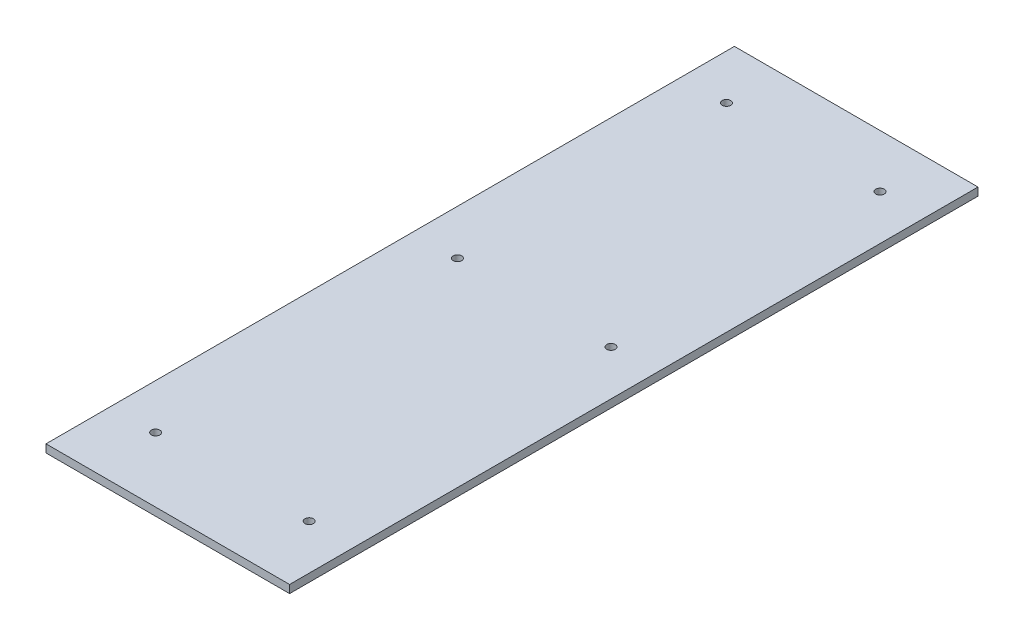
ISO-10303-21;
HEADER;
FILE_DESCRIPTION(('STEP AP214'),'2;1');
FILE_NAME('part.step','',(''),(''),'','','');
FILE_SCHEMA(('AUTOMOTIVE_DESIGN { 1 0 10303 214 1 1 1 1 }'));
ENDSEC;
DATA;
#1=APPLICATION_CONTEXT('core data for automotive mechanical design processes');
#2=APPLICATION_PROTOCOL_DEFINITION('international standard','automotive_design',2000,#1);
#3=PRODUCT_CONTEXT('',#1,'mechanical');
#4=PRODUCT('Part','Part','',(#3));
#5=PRODUCT_RELATED_PRODUCT_CATEGORY('part','',(#4));
#6=PRODUCT_DEFINITION_FORMATION('','',#4);
#7=PRODUCT_DEFINITION_CONTEXT('part definition',#1,'design');
#8=PRODUCT_DEFINITION('design','',#6,#7);
#9=PRODUCT_DEFINITION_SHAPE('','',#8);
#10=(LENGTH_UNIT() NAMED_UNIT(*) SI_UNIT(.MILLI.,.METRE.));
#11=(NAMED_UNIT(*) PLANE_ANGLE_UNIT() SI_UNIT($,.RADIAN.));
#12=(NAMED_UNIT(*) SI_UNIT($,.STERADIAN.) SOLID_ANGLE_UNIT());
#13=UNCERTAINTY_MEASURE_WITH_UNIT(LENGTH_MEASURE(1.E-05),#10,'distance_accuracy_value','');
#14=(GEOMETRIC_REPRESENTATION_CONTEXT(3) GLOBAL_UNCERTAINTY_ASSIGNED_CONTEXT((#13)) GLOBAL_UNIT_ASSIGNED_CONTEXT((#10,
#11,#12)) REPRESENTATION_CONTEXT('',''));
#15=CARTESIAN_POINT('',(0.,0.,0.));
#16=DIRECTION('',(0.,0.,1.));
#17=DIRECTION('',(1.,0.,0.));
#18=AXIS2_PLACEMENT_3D('',#15,#16,#17);
#19=CARTESIAN_POINT('',(-34.9254791999666,3.,-37.0612099424105));
#20=DIRECTION('',(1.,0.,0.));
#21=DIRECTION('',(0.,0.,-1.));
#22=AXIS2_PLACEMENT_3D('',#19,#20,#21);
#23=PLANE('',#22);
#24=DIRECTION('',(0.,0.,1.));
#25=VECTOR('',#24,1.);
#26=CARTESIAN_POINT('',(-34.9254791999666,0.,-37.0612099424105));
#27=LINE('',#26,#25);
#28=CARTESIAN_POINT('',(-34.9254791999666,0.,-37.0612099424105));
#29=VERTEX_POINT('',#28);
#30=CARTESIAN_POINT('',(-34.9254791999665,0.,222.93879005759));
#31=VERTEX_POINT('',#30);
#32=EDGE_CURVE('E96',#29,#31,#27,.T.);
#33=ORIENTED_EDGE('',*,*,#32,.T.);
#34=DIRECTION('',(0.,-1.,0.));
#35=VECTOR('',#34,1.);
#36=CARTESIAN_POINT('',(-34.9254791999665,3.,222.93879005759));
#37=LINE('',#36,#35);
#38=CARTESIAN_POINT('',(-34.9254791999665,3.,222.93879005759));
#39=VERTEX_POINT('',#38);
#40=EDGE_CURVE('E11',#39,#31,#37,.T.);
#41=ORIENTED_EDGE('',*,*,#40,.F.);
#42=DIRECTION('',(0.,0.,1.));
#43=VECTOR('',#42,1.);
#44=CARTESIAN_POINT('',(-34.9254791999666,3.,-37.0612099424105));
#45=LINE('',#44,#43);
#46=CARTESIAN_POINT('',(-34.9254791999666,3.,-37.0612099424105));
#47=VERTEX_POINT('',#46);
#48=EDGE_CURVE('E82',#47,#39,#45,.T.);
#49=ORIENTED_EDGE('',*,*,#48,.F.);
#50=DIRECTION('',(0.,-1.,0.));
#51=VECTOR('',#50,1.);
#52=CARTESIAN_POINT('',(-34.9254791999666,3.,-37.0612099424105));
#53=LINE('',#52,#51);
#54=EDGE_CURVE('E49',#47,#29,#53,.T.);
#55=ORIENTED_EDGE('',*,*,#54,.T.);
#56=EDGE_LOOP('',(#33,#41,#49,#55));
#57=FACE_BOUND('',#56,.T.);
#58=ADVANCED_FACE('F33',(#57),#23,.F.);
#59=CARTESIAN_POINT('',(-34.9254791999665,3.,222.93879005759));
#60=DIRECTION('',(0.,0.,-1.));
#61=DIRECTION('',(-1.,0.,0.));
#62=AXIS2_PLACEMENT_3D('',#59,#60,#61);
#63=PLANE('',#62);
#64=DIRECTION('',(1.,0.,0.));
#65=VECTOR('',#64,1.);
#66=CARTESIAN_POINT('',(-34.9254791999665,0.,222.93879005759));
#67=LINE('',#66,#65);
#68=CARTESIAN_POINT('',(57.0745208000335,0.,222.93879005759));
#69=VERTEX_POINT('',#68);
#70=EDGE_CURVE('E87',#31,#69,#67,.T.);
#71=ORIENTED_EDGE('',*,*,#70,.T.);
#72=DIRECTION('',(0.,-1.,0.));
#73=VECTOR('',#72,1.);
#74=CARTESIAN_POINT('',(57.0745208000335,3.,222.93879005759));
#75=LINE('',#74,#73);
#76=CARTESIAN_POINT('',(57.0745208000335,3.,222.93879005759));
#77=VERTEX_POINT('',#76);
#78=EDGE_CURVE('E41',#77,#69,#75,.T.);
#79=ORIENTED_EDGE('',*,*,#78,.F.);
#80=DIRECTION('',(1.,0.,0.));
#81=VECTOR('',#80,1.);
#82=CARTESIAN_POINT('',(-34.9254791999665,3.,222.93879005759));
#83=LINE('',#82,#81);
#84=EDGE_CURVE('E74',#39,#77,#83,.T.);
#85=ORIENTED_EDGE('',*,*,#84,.F.);
#86=ORIENTED_EDGE('',*,*,#40,.T.);
#87=EDGE_LOOP('',(#71,#79,#85,#86));
#88=FACE_BOUND('',#87,.T.);
#89=ADVANCED_FACE('F86',(#88),#63,.F.);
#90=CARTESIAN_POINT('',(57.0745208000334,3.,-37.0612099424105));
#91=DIRECTION('',(1.,0.,0.));
#92=DIRECTION('',(0.,0.,-1.));
#93=AXIS2_PLACEMENT_3D('',#90,#91,#92);
#94=PLANE('',#93);
#95=DIRECTION('',(0.,0.,1.));
#96=VECTOR('',#95,1.);
#97=CARTESIAN_POINT('',(57.0745208000334,0.,-37.0612099424105));
#98=LINE('',#97,#96);
#99=CARTESIAN_POINT('',(57.0745208000334,0.,-37.0612099424105));
#100=VERTEX_POINT('',#99);
#101=EDGE_CURVE('E100',#100,#69,#98,.T.);
#102=ORIENTED_EDGE('',*,*,#101,.F.);
#103=DIRECTION('',(0.,-1.,0.));
#104=VECTOR('',#103,1.);
#105=CARTESIAN_POINT('',(57.0745208000334,3.,-37.0612099424105));
#106=LINE('',#105,#104);
#107=CARTESIAN_POINT('',(57.0745208000334,3.,-37.0612099424105));
#108=VERTEX_POINT('',#107);
#109=EDGE_CURVE('E63',#108,#100,#106,.T.);
#110=ORIENTED_EDGE('',*,*,#109,.F.);
#111=DIRECTION('',(0.,0.,1.));
#112=VECTOR('',#111,1.);
#113=CARTESIAN_POINT('',(57.0745208000334,3.,-37.0612099424105));
#114=LINE('',#113,#112);
#115=EDGE_CURVE('E81',#108,#77,#114,.T.);
#116=ORIENTED_EDGE('',*,*,#115,.T.);
#117=ORIENTED_EDGE('',*,*,#78,.T.);
#118=EDGE_LOOP('',(#102,#110,#116,#117));
#119=FACE_BOUND('',#118,.T.);
#120=ADVANCED_FACE('F90',(#119),#94,.T.);
#121=CARTESIAN_POINT('',(-34.9254791999666,3.,-37.0612099424105));
#122=DIRECTION('',(0.,0.,-1.));
#123=DIRECTION('',(-1.,0.,0.));
#124=AXIS2_PLACEMENT_3D('',#121,#122,#123);
#125=PLANE('',#124);
#126=DIRECTION('',(1.,0.,0.));
#127=VECTOR('',#126,1.);
#128=CARTESIAN_POINT('',(-34.9254791999666,0.,-37.0612099424105));
#129=LINE('',#128,#127);
#130=EDGE_CURVE('E102',#29,#100,#129,.T.);
#131=ORIENTED_EDGE('',*,*,#130,.F.);
#132=ORIENTED_EDGE('',*,*,#54,.F.);
#133=DIRECTION('',(1.,0.,0.));
#134=VECTOR('',#133,1.);
#135=CARTESIAN_POINT('',(-34.9254791999666,3.,-37.0612099424105));
#136=LINE('',#135,#134);
#137=EDGE_CURVE('E91',#47,#108,#136,.T.);
#138=ORIENTED_EDGE('',*,*,#137,.T.);
#139=ORIENTED_EDGE('',*,*,#109,.T.);
#140=EDGE_LOOP('',(#131,#132,#138,#139));
#141=FACE_BOUND('',#140,.T.);
#142=ADVANCED_FACE('F150',(#141),#125,.T.);
#143=CARTESIAN_POINT('',(0.,3.,0.));
#144=DIRECTION('',(0.,1.,0.));
#145=DIRECTION('',(0.,0.,1.));
#146=AXIS2_PLACEMENT_3D('',#143,#144,#145);
#147=PLANE('',#146);
#148=CARTESIAN_POINT('',(40.0745208000335,3.,-17.0612099424105));
#149=DIRECTION('',(0.,1.,0.));
#150=DIRECTION('',(0.,0.,1.));
#151=AXIS2_PLACEMENT_3D('',#148,#149,#150);
#152=CIRCLE('',#151,1.6);
#153=CARTESIAN_POINT('',(40.0745208000335,3.,-15.4612099424105));
#154=VERTEX_POINT('',#153);
#155=EDGE_CURVE('E140',#154,#154,#152,.T.);
#156=ORIENTED_EDGE('',*,*,#155,.F.);
#157=EDGE_LOOP('',(#156));
#158=FACE_BOUND('',#157,.T.);
#159=CARTESIAN_POINT('',(-17.9254791999666,3.,-17.0612099424105));
#160=DIRECTION('',(0.,1.,0.));
#161=DIRECTION('',(0.,0.,1.));
#162=AXIS2_PLACEMENT_3D('',#159,#160,#161);
#163=CIRCLE('',#162,1.6);
#164=CARTESIAN_POINT('',(-17.9254791999666,3.,-15.4612099424105));
#165=VERTEX_POINT('',#164);
#166=EDGE_CURVE('E134',#165,#165,#163,.T.);
#167=ORIENTED_EDGE('',*,*,#166,.F.);
#168=EDGE_LOOP('',(#167));
#169=FACE_BOUND('',#168,.T.);
#170=CARTESIAN_POINT('',(40.0745208000335,3.,84.5387900575895));
#171=DIRECTION('',(0.,1.,0.));
#172=DIRECTION('',(0.,0.,1.));
#173=AXIS2_PLACEMENT_3D('',#170,#171,#172);
#174=CIRCLE('',#173,1.60000000000001);
#175=CARTESIAN_POINT('',(40.0745208000335,3.,86.1387900575895));
#176=VERTEX_POINT('',#175);
#177=EDGE_CURVE('E128',#176,#176,#174,.T.);
#178=ORIENTED_EDGE('',*,*,#177,.F.);
#179=EDGE_LOOP('',(#178));
#180=FACE_BOUND('',#179,.T.);
#181=CARTESIAN_POINT('',(-17.9254791999666,3.,84.5387900575895));
#182=DIRECTION('',(0.,1.,0.));
#183=DIRECTION('',(0.,0.,1.));
#184=AXIS2_PLACEMENT_3D('',#181,#182,#183);
#185=CIRCLE('',#184,1.60000000000001);
#186=CARTESIAN_POINT('',(-17.9254791999666,3.,86.1387900575895));
#187=VERTEX_POINT('',#186);
#188=EDGE_CURVE('E122',#187,#187,#185,.T.);
#189=ORIENTED_EDGE('',*,*,#188,.F.);
#190=EDGE_LOOP('',(#189));
#191=FACE_BOUND('',#190,.T.);
#192=CARTESIAN_POINT('',(40.0745208000335,3.,198.538790057589));
#193=DIRECTION('',(0.,1.,0.));
#194=DIRECTION('',(0.,0.,1.));
#195=AXIS2_PLACEMENT_3D('',#192,#193,#194);
#196=CIRCLE('',#195,1.6);
#197=CARTESIAN_POINT('',(40.0745208000335,3.,200.138790057589));
#198=VERTEX_POINT('',#197);
#199=EDGE_CURVE('E116',#198,#198,#196,.T.);
#200=ORIENTED_EDGE('',*,*,#199,.F.);
#201=EDGE_LOOP('',(#200));
#202=FACE_BOUND('',#201,.T.);
#203=CARTESIAN_POINT('',(-17.9254791999666,3.,198.538790057589));
#204=DIRECTION('',(0.,1.,0.));
#205=DIRECTION('',(0.,0.,1.));
#206=AXIS2_PLACEMENT_3D('',#203,#204,#205);
#207=CIRCLE('',#206,1.59999999999999);
#208=CARTESIAN_POINT('',(-17.9254791999666,3.,200.138790057589));
#209=VERTEX_POINT('',#208);
#210=EDGE_CURVE('E110',#209,#209,#207,.T.);
#211=ORIENTED_EDGE('',*,*,#210,.F.);
#212=EDGE_LOOP('',(#211));
#213=FACE_BOUND('',#212,.T.);
#214=ORIENTED_EDGE('',*,*,#48,.T.);
#215=ORIENTED_EDGE('',*,*,#84,.T.);
#216=ORIENTED_EDGE('',*,*,#115,.F.);
#217=ORIENTED_EDGE('',*,*,#137,.F.);
#218=EDGE_LOOP('',(#214,#215,#216,#217));
#219=FACE_BOUND('',#218,.T.);
#220=ADVANCED_FACE('F78',(#158,#169,#180,#191,#202,#213,#219),#147,.T.);
#221=CARTESIAN_POINT('',(0.,0.,0.));
#222=DIRECTION('',(0.,1.,0.));
#223=DIRECTION('',(0.,0.,1.));
#224=AXIS2_PLACEMENT_3D('',#221,#222,#223);
#225=PLANE('',#224);
#226=CARTESIAN_POINT('',(40.0745208000335,0.,-17.0612099424105));
#227=DIRECTION('',(0.,1.,0.));
#228=DIRECTION('',(0.,0.,1.));
#229=AXIS2_PLACEMENT_3D('',#226,#227,#228);
#230=CIRCLE('',#229,1.6);
#231=CARTESIAN_POINT('',(40.0745208000335,0.,-15.4612099424105));
#232=VERTEX_POINT('',#231);
#233=EDGE_CURVE('E137',#232,#232,#230,.F.);
#234=ORIENTED_EDGE('',*,*,#233,.F.);
#235=EDGE_LOOP('',(#234));
#236=FACE_BOUND('',#235,.T.);
#237=CARTESIAN_POINT('',(-17.9254791999666,0.,-17.0612099424105));
#238=DIRECTION('',(0.,1.,0.));
#239=DIRECTION('',(0.,0.,1.));
#240=AXIS2_PLACEMENT_3D('',#237,#238,#239);
#241=CIRCLE('',#240,1.6);
#242=CARTESIAN_POINT('',(-17.9254791999666,0.,-15.4612099424105));
#243=VERTEX_POINT('',#242);
#244=EDGE_CURVE('E131',#243,#243,#241,.F.);
#245=ORIENTED_EDGE('',*,*,#244,.F.);
#246=EDGE_LOOP('',(#245));
#247=FACE_BOUND('',#246,.T.);
#248=CARTESIAN_POINT('',(40.0745208000335,0.,84.5387900575895));
#249=DIRECTION('',(0.,1.,0.));
#250=DIRECTION('',(0.,0.,1.));
#251=AXIS2_PLACEMENT_3D('',#248,#249,#250);
#252=CIRCLE('',#251,1.60000000000001);
#253=CARTESIAN_POINT('',(40.0745208000335,0.,86.1387900575895));
#254=VERTEX_POINT('',#253);
#255=EDGE_CURVE('E125',#254,#254,#252,.F.);
#256=ORIENTED_EDGE('',*,*,#255,.F.);
#257=EDGE_LOOP('',(#256));
#258=FACE_BOUND('',#257,.T.);
#259=CARTESIAN_POINT('',(-17.9254791999666,0.,84.5387900575895));
#260=DIRECTION('',(0.,1.,0.));
#261=DIRECTION('',(0.,0.,1.));
#262=AXIS2_PLACEMENT_3D('',#259,#260,#261);
#263=CIRCLE('',#262,1.60000000000001);
#264=CARTESIAN_POINT('',(-17.9254791999666,0.,86.1387900575895));
#265=VERTEX_POINT('',#264);
#266=EDGE_CURVE('E119',#265,#265,#263,.F.);
#267=ORIENTED_EDGE('',*,*,#266,.F.);
#268=EDGE_LOOP('',(#267));
#269=FACE_BOUND('',#268,.T.);
#270=CARTESIAN_POINT('',(40.0745208000335,0.,198.538790057589));
#271=DIRECTION('',(0.,1.,0.));
#272=DIRECTION('',(0.,0.,1.));
#273=AXIS2_PLACEMENT_3D('',#270,#271,#272);
#274=CIRCLE('',#273,1.6);
#275=CARTESIAN_POINT('',(40.0745208000335,0.,200.138790057589));
#276=VERTEX_POINT('',#275);
#277=EDGE_CURVE('E113',#276,#276,#274,.F.);
#278=ORIENTED_EDGE('',*,*,#277,.F.);
#279=EDGE_LOOP('',(#278));
#280=FACE_BOUND('',#279,.T.);
#281=CARTESIAN_POINT('',(-17.9254791999666,0.,198.538790057589));
#282=DIRECTION('',(0.,1.,0.));
#283=DIRECTION('',(0.,0.,1.));
#284=AXIS2_PLACEMENT_3D('',#281,#282,#283);
#285=CIRCLE('',#284,1.59999999999999);
#286=CARTESIAN_POINT('',(-17.9254791999666,0.,200.138790057589));
#287=VERTEX_POINT('',#286);
#288=EDGE_CURVE('E98',#287,#287,#285,.F.);
#289=ORIENTED_EDGE('',*,*,#288,.F.);
#290=EDGE_LOOP('',(#289));
#291=FACE_BOUND('',#290,.T.);
#292=ORIENTED_EDGE('',*,*,#32,.F.);
#293=ORIENTED_EDGE('',*,*,#130,.T.);
#294=ORIENTED_EDGE('',*,*,#101,.T.);
#295=ORIENTED_EDGE('',*,*,#70,.F.);
#296=EDGE_LOOP('',(#292,#293,#294,#295));
#297=FACE_BOUND('',#296,.T.);
#298=ADVANCED_FACE('F149',(#236,#247,#258,#269,#280,#291,#297),#225,.F.);
#299=CARTESIAN_POINT('',(-17.9254791999666,-0.00100000000000013,198.538790057589));
#300=DIRECTION('',(0.,1.,0.));
#301=DIRECTION('',(0.,0.,1.));
#302=AXIS2_PLACEMENT_3D('',#299,#300,#301);
#303=CYLINDRICAL_SURFACE('',#302,1.59999999999999);
#304=CARTESIAN_POINT('',(-17.9254791999666,3.,200.138790057589));
#305=CARTESIAN_POINT('',(-17.9254791999666,2.96875,200.138790057589));
#306=CARTESIAN_POINT('',(-17.9254791999666,2.9375,200.138790057589));
#307=CARTESIAN_POINT('',(-17.9254791999666,2.875,200.138790057589));
#308=CARTESIAN_POINT('',(-17.9254791999666,2.84375,200.138790057589));
#309=CARTESIAN_POINT('',(-17.9254791999666,2.78125,200.138790057589));
#310=CARTESIAN_POINT('',(-17.9254791999666,2.75,200.138790057589));
#311=CARTESIAN_POINT('',(-17.9254791999666,2.6875,200.138790057589));
#312=CARTESIAN_POINT('',(-17.9254791999666,2.65625,200.138790057589));
#313=CARTESIAN_POINT('',(-17.9254791999666,2.59375,200.138790057589));
#314=CARTESIAN_POINT('',(-17.9254791999666,2.5625,200.138790057589));
#315=CARTESIAN_POINT('',(-17.9254791999666,2.5,200.138790057589));
#316=CARTESIAN_POINT('',(-17.9254791999666,2.46875,200.138790057589));
#317=CARTESIAN_POINT('',(-17.9254791999666,2.40625,200.138790057589));
#318=CARTESIAN_POINT('',(-17.9254791999666,2.375,200.138790057589));
#319=CARTESIAN_POINT('',(-17.9254791999666,2.3125,200.138790057589));
#320=CARTESIAN_POINT('',(-17.9254791999666,2.28125,200.138790057589));
#321=CARTESIAN_POINT('',(-17.9254791999666,2.21875,200.138790057589));
#322=CARTESIAN_POINT('',(-17.9254791999666,2.1875,200.138790057589));
#323=CARTESIAN_POINT('',(-17.9254791999666,2.125,200.138790057589));
#324=CARTESIAN_POINT('',(-17.9254791999666,2.09375,200.138790057589));
#325=CARTESIAN_POINT('',(-17.9254791999666,2.03125,200.138790057589));
#326=CARTESIAN_POINT('',(-17.9254791999666,2.,200.138790057589));
#327=CARTESIAN_POINT('',(-17.9254791999666,1.9375,200.138790057589));
#328=CARTESIAN_POINT('',(-17.9254791999666,1.90625,200.138790057589));
#329=CARTESIAN_POINT('',(-17.9254791999666,1.84375,200.138790057589));
#330=CARTESIAN_POINT('',(-17.9254791999666,1.8125,200.138790057589));
#331=CARTESIAN_POINT('',(-17.9254791999666,1.75,200.138790057589));
#332=CARTESIAN_POINT('',(-17.9254791999666,1.71875,200.138790057589));
#333=CARTESIAN_POINT('',(-17.9254791999666,1.65625,200.138790057589));
#334=CARTESIAN_POINT('',(-17.9254791999666,1.625,200.138790057589));
#335=CARTESIAN_POINT('',(-17.9254791999666,1.5625,200.138790057589));
#336=CARTESIAN_POINT('',(-17.9254791999666,1.53125,200.138790057589));
#337=CARTESIAN_POINT('',(-17.9254791999666,1.46875,200.138790057589));
#338=CARTESIAN_POINT('',(-17.9254791999666,1.4375,200.138790057589));
#339=CARTESIAN_POINT('',(-17.9254791999666,1.375,200.138790057589));
#340=CARTESIAN_POINT('',(-17.9254791999666,1.34375,200.138790057589));
#341=CARTESIAN_POINT('',(-17.9254791999666,1.28125,200.138790057589));
#342=CARTESIAN_POINT('',(-17.9254791999666,1.25,200.138790057589));
#343=CARTESIAN_POINT('',(-17.9254791999666,1.1875,200.138790057589));
#344=CARTESIAN_POINT('',(-17.9254791999666,1.15625,200.138790057589));
#345=CARTESIAN_POINT('',(-17.9254791999666,1.09375,200.138790057589));
#346=CARTESIAN_POINT('',(-17.9254791999666,1.0625,200.138790057589));
#347=CARTESIAN_POINT('',(-17.9254791999666,1.,200.138790057589));
#348=CARTESIAN_POINT('',(-17.9254791999666,0.96875,200.138790057589));
#349=CARTESIAN_POINT('',(-17.9254791999666,0.90625,200.138790057589));
#350=CARTESIAN_POINT('',(-17.9254791999666,0.875,200.138790057589));
#351=CARTESIAN_POINT('',(-17.9254791999666,0.8125,200.138790057589));
#352=CARTESIAN_POINT('',(-17.9254791999666,0.78125,200.138790057589));
#353=CARTESIAN_POINT('',(-17.9254791999666,0.71875,200.138790057589));
#354=CARTESIAN_POINT('',(-17.9254791999666,0.6875,200.138790057589));
#355=CARTESIAN_POINT('',(-17.9254791999666,0.625,200.138790057589));
#356=CARTESIAN_POINT('',(-17.9254791999666,0.59375,200.138790057589));
#357=CARTESIAN_POINT('',(-17.9254791999666,0.53125,200.138790057589));
#358=CARTESIAN_POINT('',(-17.9254791999666,0.5,200.138790057589));
#359=CARTESIAN_POINT('',(-17.9254791999666,0.4375,200.138790057589));
#360=CARTESIAN_POINT('',(-17.9254791999666,0.40625,200.138790057589));
#361=CARTESIAN_POINT('',(-17.9254791999666,0.34375,200.138790057589));
#362=CARTESIAN_POINT('',(-17.9254791999666,0.3125,200.138790057589));
#363=CARTESIAN_POINT('',(-17.9254791999666,0.25,200.138790057589));
#364=CARTESIAN_POINT('',(-17.9254791999666,0.21875,200.138790057589));
#365=CARTESIAN_POINT('',(-17.9254791999666,0.15625,200.138790057589));
#366=CARTESIAN_POINT('',(-17.9254791999666,0.125,200.138790057589));
#367=CARTESIAN_POINT('',(-17.9254791999666,0.0625000000000001,200.138790057589));
#368=CARTESIAN_POINT('',(-17.9254791999666,0.0312500000000001,200.138790057589));
#369=CARTESIAN_POINT('',(-17.9254791999666,0.,200.138790057589));
#370=B_SPLINE_CURVE_WITH_KNOTS('',3,(#304,#305,#306,#307,#308,#309,#310,#311,#312,#313,#314,
#315,#316,#317,#318,#319,#320,#321,#322,#323,#324,#325,#326,#327,#328,#329,#330,#331,#332,#333,
#334,#335,#336,#337,#338,#339,#340,#341,#342,#343,#344,#345,#346,#347,#348,#349,#350,#351,#352,
#353,#354,#355,#356,#357,#358,#359,#360,#361,#362,#363,#364,#365,#366,#367,#368,#369),
.UNSPECIFIED.,.F.,.F.,(4,2,2,2,2,2,2,2,2,2,2,2,2,2,2,2,2,2,2,2,2,2,2,2,2,2,2,2,2,2,2,2,4),(0.,
0.0937500000000001,0.1875,0.28125,0.375,0.46875,0.5625,0.65625,0.75,0.84375,0.9375,1.03125,
1.125,1.21875,1.3125,1.40625,1.5,1.59375,1.6875,1.78125,1.875,1.96875,2.0625,2.15625,2.25,
2.34375,2.4375,2.53125,2.625,2.71875,2.8125,2.90625,3.),.UNSPECIFIED.);
#371=EDGE_CURVE('BSEAM162',#209,#287,#370,.T.);
#372=ORIENTED_EDGE('',*,*,#210,.T.);
#373=ORIENTED_EDGE('',*,*,#288,.T.);
#374=ORIENTED_EDGE('',*,*,#371,.T.);
#375=ORIENTED_EDGE('',*,*,#371,.F.);
#376=EDGE_LOOP('',(#372,#374,#373,#375));
#377=FACE_BOUND('',#376,.T.);
#378=ADVANCED_FACE('F162',(#377),#303,.F.);
#379=CARTESIAN_POINT('',(40.0745208000335,-0.00100000000000013,198.538790057589));
#380=DIRECTION('',(0.,1.,0.));
#381=DIRECTION('',(0.,0.,1.));
#382=AXIS2_PLACEMENT_3D('',#379,#380,#381);
#383=CYLINDRICAL_SURFACE('',#382,1.6);
#384=CARTESIAN_POINT('',(40.0745208000335,3.,200.138790057589));
#385=CARTESIAN_POINT('',(40.0745208000335,2.96875,200.138790057589));
#386=CARTESIAN_POINT('',(40.0745208000335,2.9375,200.138790057589));
#387=CARTESIAN_POINT('',(40.0745208000335,2.875,200.138790057589));
#388=CARTESIAN_POINT('',(40.0745208000335,2.84375,200.138790057589));
#389=CARTESIAN_POINT('',(40.0745208000335,2.78125,200.138790057589));
#390=CARTESIAN_POINT('',(40.0745208000335,2.75,200.138790057589));
#391=CARTESIAN_POINT('',(40.0745208000335,2.6875,200.138790057589));
#392=CARTESIAN_POINT('',(40.0745208000335,2.65625,200.138790057589));
#393=CARTESIAN_POINT('',(40.0745208000335,2.59375,200.138790057589));
#394=CARTESIAN_POINT('',(40.0745208000335,2.5625,200.138790057589));
#395=CARTESIAN_POINT('',(40.0745208000335,2.5,200.138790057589));
#396=CARTESIAN_POINT('',(40.0745208000335,2.46875,200.138790057589));
#397=CARTESIAN_POINT('',(40.0745208000335,2.40625,200.138790057589));
#398=CARTESIAN_POINT('',(40.0745208000335,2.375,200.138790057589));
#399=CARTESIAN_POINT('',(40.0745208000335,2.3125,200.138790057589));
#400=CARTESIAN_POINT('',(40.0745208000335,2.28125,200.138790057589));
#401=CARTESIAN_POINT('',(40.0745208000335,2.21875,200.138790057589));
#402=CARTESIAN_POINT('',(40.0745208000335,2.1875,200.138790057589));
#403=CARTESIAN_POINT('',(40.0745208000335,2.125,200.138790057589));
#404=CARTESIAN_POINT('',(40.0745208000335,2.09375,200.138790057589));
#405=CARTESIAN_POINT('',(40.0745208000335,2.03125,200.138790057589));
#406=CARTESIAN_POINT('',(40.0745208000335,2.,200.138790057589));
#407=CARTESIAN_POINT('',(40.0745208000335,1.9375,200.138790057589));
#408=CARTESIAN_POINT('',(40.0745208000335,1.90625,200.138790057589));
#409=CARTESIAN_POINT('',(40.0745208000335,1.84375,200.138790057589));
#410=CARTESIAN_POINT('',(40.0745208000335,1.8125,200.138790057589));
#411=CARTESIAN_POINT('',(40.0745208000335,1.75,200.138790057589));
#412=CARTESIAN_POINT('',(40.0745208000335,1.71875,200.138790057589));
#413=CARTESIAN_POINT('',(40.0745208000335,1.65625,200.138790057589));
#414=CARTESIAN_POINT('',(40.0745208000335,1.625,200.138790057589));
#415=CARTESIAN_POINT('',(40.0745208000335,1.5625,200.138790057589));
#416=CARTESIAN_POINT('',(40.0745208000335,1.53125,200.138790057589));
#417=CARTESIAN_POINT('',(40.0745208000335,1.46875,200.138790057589));
#418=CARTESIAN_POINT('',(40.0745208000335,1.4375,200.138790057589));
#419=CARTESIAN_POINT('',(40.0745208000335,1.375,200.138790057589));
#420=CARTESIAN_POINT('',(40.0745208000335,1.34375,200.138790057589));
#421=CARTESIAN_POINT('',(40.0745208000335,1.28125,200.138790057589));
#422=CARTESIAN_POINT('',(40.0745208000335,1.25,200.138790057589));
#423=CARTESIAN_POINT('',(40.0745208000335,1.1875,200.138790057589));
#424=CARTESIAN_POINT('',(40.0745208000335,1.15625,200.138790057589));
#425=CARTESIAN_POINT('',(40.0745208000335,1.09375,200.138790057589));
#426=CARTESIAN_POINT('',(40.0745208000335,1.0625,200.138790057589));
#427=CARTESIAN_POINT('',(40.0745208000335,1.,200.138790057589));
#428=CARTESIAN_POINT('',(40.0745208000335,0.96875,200.138790057589));
#429=CARTESIAN_POINT('',(40.0745208000335,0.90625,200.138790057589));
#430=CARTESIAN_POINT('',(40.0745208000335,0.875,200.138790057589));
#431=CARTESIAN_POINT('',(40.0745208000335,0.8125,200.138790057589));
#432=CARTESIAN_POINT('',(40.0745208000335,0.78125,200.138790057589));
#433=CARTESIAN_POINT('',(40.0745208000335,0.71875,200.138790057589));
#434=CARTESIAN_POINT('',(40.0745208000335,0.6875,200.138790057589));
#435=CARTESIAN_POINT('',(40.0745208000335,0.625,200.138790057589));
#436=CARTESIAN_POINT('',(40.0745208000335,0.59375,200.138790057589));
#437=CARTESIAN_POINT('',(40.0745208000335,0.53125,200.138790057589));
#438=CARTESIAN_POINT('',(40.0745208000335,0.5,200.138790057589));
#439=CARTESIAN_POINT('',(40.0745208000335,0.4375,200.138790057589));
#440=CARTESIAN_POINT('',(40.0745208000335,0.40625,200.138790057589));
#441=CARTESIAN_POINT('',(40.0745208000335,0.34375,200.138790057589));
#442=CARTESIAN_POINT('',(40.0745208000335,0.3125,200.138790057589));
#443=CARTESIAN_POINT('',(40.0745208000335,0.25,200.138790057589));
#444=CARTESIAN_POINT('',(40.0745208000335,0.21875,200.138790057589));
#445=CARTESIAN_POINT('',(40.0745208000335,0.15625,200.138790057589));
#446=CARTESIAN_POINT('',(40.0745208000335,0.125,200.138790057589));
#447=CARTESIAN_POINT('',(40.0745208000335,0.0625000000000001,200.138790057589));
#448=CARTESIAN_POINT('',(40.0745208000335,0.0312500000000001,200.138790057589));
#449=CARTESIAN_POINT('',(40.0745208000335,0.,200.138790057589));
#450=B_SPLINE_CURVE_WITH_KNOTS('',3,(#384,#385,#386,#387,#388,#389,#390,#391,#392,#393,#394,
#395,#396,#397,#398,#399,#400,#401,#402,#403,#404,#405,#406,#407,#408,#409,#410,#411,#412,#413,
#414,#415,#416,#417,#418,#419,#420,#421,#422,#423,#424,#425,#426,#427,#428,#429,#430,#431,#432,
#433,#434,#435,#436,#437,#438,#439,#440,#441,#442,#443,#444,#445,#446,#447,#448,#449),
.UNSPECIFIED.,.F.,.F.,(4,2,2,2,2,2,2,2,2,2,2,2,2,2,2,2,2,2,2,2,2,2,2,2,2,2,2,2,2,2,2,2,4),(0.,
0.0937500000000001,0.1875,0.28125,0.375,0.46875,0.5625,0.65625,0.75,0.84375,0.9375,1.03125,
1.125,1.21875,1.3125,1.40625,1.5,1.59375,1.6875,1.78125,1.875,1.96875,2.0625,2.15625,2.25,
2.34375,2.4375,2.53125,2.625,2.71875,2.8125,2.90625,3.),.UNSPECIFIED.);
#451=EDGE_CURVE('BSEAM165',#198,#276,#450,.T.);
#452=ORIENTED_EDGE('',*,*,#199,.T.);
#453=ORIENTED_EDGE('',*,*,#277,.T.);
#454=ORIENTED_EDGE('',*,*,#451,.T.);
#455=ORIENTED_EDGE('',*,*,#451,.F.);
#456=EDGE_LOOP('',(#452,#454,#453,#455));
#457=FACE_BOUND('',#456,.T.);
#458=ADVANCED_FACE('F165',(#457),#383,.F.);
#459=CARTESIAN_POINT('',(-17.9254791999666,-0.00100000000000013,84.5387900575895));
#460=DIRECTION('',(0.,1.,0.));
#461=DIRECTION('',(0.,0.,1.));
#462=AXIS2_PLACEMENT_3D('',#459,#460,#461);
#463=CYLINDRICAL_SURFACE('',#462,1.60000000000001);
#464=CARTESIAN_POINT('',(-17.9254791999666,3.,86.1387900575895));
#465=CARTESIAN_POINT('',(-17.9254791999666,2.96875,86.1387900575895));
#466=CARTESIAN_POINT('',(-17.9254791999666,2.9375,86.1387900575895));
#467=CARTESIAN_POINT('',(-17.9254791999666,2.875,86.1387900575895));
#468=CARTESIAN_POINT('',(-17.9254791999666,2.84375,86.1387900575895));
#469=CARTESIAN_POINT('',(-17.9254791999666,2.78125,86.1387900575895));
#470=CARTESIAN_POINT('',(-17.9254791999666,2.75,86.1387900575895));
#471=CARTESIAN_POINT('',(-17.9254791999666,2.6875,86.1387900575895));
#472=CARTESIAN_POINT('',(-17.9254791999666,2.65625,86.1387900575895));
#473=CARTESIAN_POINT('',(-17.9254791999666,2.59375,86.1387900575895));
#474=CARTESIAN_POINT('',(-17.9254791999666,2.5625,86.1387900575895));
#475=CARTESIAN_POINT('',(-17.9254791999666,2.5,86.1387900575895));
#476=CARTESIAN_POINT('',(-17.9254791999666,2.46875,86.1387900575895));
#477=CARTESIAN_POINT('',(-17.9254791999666,2.40625,86.1387900575895));
#478=CARTESIAN_POINT('',(-17.9254791999666,2.375,86.1387900575895));
#479=CARTESIAN_POINT('',(-17.9254791999666,2.3125,86.1387900575895));
#480=CARTESIAN_POINT('',(-17.9254791999666,2.28125,86.1387900575895));
#481=CARTESIAN_POINT('',(-17.9254791999666,2.21875,86.1387900575895));
#482=CARTESIAN_POINT('',(-17.9254791999666,2.1875,86.1387900575895));
#483=CARTESIAN_POINT('',(-17.9254791999666,2.125,86.1387900575895));
#484=CARTESIAN_POINT('',(-17.9254791999666,2.09375,86.1387900575895));
#485=CARTESIAN_POINT('',(-17.9254791999666,2.03125,86.1387900575895));
#486=CARTESIAN_POINT('',(-17.9254791999666,2.,86.1387900575895));
#487=CARTESIAN_POINT('',(-17.9254791999666,1.9375,86.1387900575895));
#488=CARTESIAN_POINT('',(-17.9254791999666,1.90625,86.1387900575895));
#489=CARTESIAN_POINT('',(-17.9254791999666,1.84375,86.1387900575895));
#490=CARTESIAN_POINT('',(-17.9254791999666,1.8125,86.1387900575895));
#491=CARTESIAN_POINT('',(-17.9254791999666,1.75,86.1387900575895));
#492=CARTESIAN_POINT('',(-17.9254791999666,1.71875,86.1387900575895));
#493=CARTESIAN_POINT('',(-17.9254791999666,1.65625,86.1387900575895));
#494=CARTESIAN_POINT('',(-17.9254791999666,1.625,86.1387900575895));
#495=CARTESIAN_POINT('',(-17.9254791999666,1.5625,86.1387900575895));
#496=CARTESIAN_POINT('',(-17.9254791999666,1.53125,86.1387900575895));
#497=CARTESIAN_POINT('',(-17.9254791999666,1.46875,86.1387900575895));
#498=CARTESIAN_POINT('',(-17.9254791999666,1.4375,86.1387900575895));
#499=CARTESIAN_POINT('',(-17.9254791999666,1.375,86.1387900575895));
#500=CARTESIAN_POINT('',(-17.9254791999666,1.34375,86.1387900575895));
#501=CARTESIAN_POINT('',(-17.9254791999666,1.28125,86.1387900575895));
#502=CARTESIAN_POINT('',(-17.9254791999666,1.25,86.1387900575895));
#503=CARTESIAN_POINT('',(-17.9254791999666,1.1875,86.1387900575895));
#504=CARTESIAN_POINT('',(-17.9254791999666,1.15625,86.1387900575895));
#505=CARTESIAN_POINT('',(-17.9254791999666,1.09375,86.1387900575895));
#506=CARTESIAN_POINT('',(-17.9254791999666,1.0625,86.1387900575895));
#507=CARTESIAN_POINT('',(-17.9254791999666,1.,86.1387900575895));
#508=CARTESIAN_POINT('',(-17.9254791999666,0.96875,86.1387900575895));
#509=CARTESIAN_POINT('',(-17.9254791999666,0.90625,86.1387900575895));
#510=CARTESIAN_POINT('',(-17.9254791999666,0.875,86.1387900575895));
#511=CARTESIAN_POINT('',(-17.9254791999666,0.8125,86.1387900575895));
#512=CARTESIAN_POINT('',(-17.9254791999666,0.78125,86.1387900575895));
#513=CARTESIAN_POINT('',(-17.9254791999666,0.71875,86.1387900575895));
#514=CARTESIAN_POINT('',(-17.9254791999666,0.6875,86.1387900575895));
#515=CARTESIAN_POINT('',(-17.9254791999666,0.625,86.1387900575895));
#516=CARTESIAN_POINT('',(-17.9254791999666,0.59375,86.1387900575895));
#517=CARTESIAN_POINT('',(-17.9254791999666,0.53125,86.1387900575895));
#518=CARTESIAN_POINT('',(-17.9254791999666,0.5,86.1387900575895));
#519=CARTESIAN_POINT('',(-17.9254791999666,0.4375,86.1387900575895));
#520=CARTESIAN_POINT('',(-17.9254791999666,0.40625,86.1387900575895));
#521=CARTESIAN_POINT('',(-17.9254791999666,0.34375,86.1387900575895));
#522=CARTESIAN_POINT('',(-17.9254791999666,0.3125,86.1387900575895));
#523=CARTESIAN_POINT('',(-17.9254791999666,0.25,86.1387900575895));
#524=CARTESIAN_POINT('',(-17.9254791999666,0.21875,86.1387900575895));
#525=CARTESIAN_POINT('',(-17.9254791999666,0.15625,86.1387900575895));
#526=CARTESIAN_POINT('',(-17.9254791999666,0.125,86.1387900575895));
#527=CARTESIAN_POINT('',(-17.9254791999666,0.0625000000000001,86.1387900575895));
#528=CARTESIAN_POINT('',(-17.9254791999666,0.0312500000000001,86.1387900575895));
#529=CARTESIAN_POINT('',(-17.9254791999666,0.,86.1387900575895));
#530=B_SPLINE_CURVE_WITH_KNOTS('',3,(#464,#465,#466,#467,#468,#469,#470,#471,#472,#473,#474,
#475,#476,#477,#478,#479,#480,#481,#482,#483,#484,#485,#486,#487,#488,#489,#490,#491,#492,#493,
#494,#495,#496,#497,#498,#499,#500,#501,#502,#503,#504,#505,#506,#507,#508,#509,#510,#511,#512,
#513,#514,#515,#516,#517,#518,#519,#520,#521,#522,#523,#524,#525,#526,#527,#528,#529),
.UNSPECIFIED.,.F.,.F.,(4,2,2,2,2,2,2,2,2,2,2,2,2,2,2,2,2,2,2,2,2,2,2,2,2,2,2,2,2,2,2,2,4),(0.,
0.0937500000000001,0.1875,0.28125,0.375,0.46875,0.5625,0.65625,0.75,0.84375,0.9375,1.03125,
1.125,1.21875,1.3125,1.40625,1.5,1.59375,1.6875,1.78125,1.875,1.96875,2.0625,2.15625,2.25,
2.34375,2.4375,2.53125,2.625,2.71875,2.8125,2.90625,3.),.UNSPECIFIED.);
#531=EDGE_CURVE('BSEAM219',#187,#265,#530,.T.);
#532=ORIENTED_EDGE('',*,*,#188,.T.);
#533=ORIENTED_EDGE('',*,*,#266,.T.);
#534=ORIENTED_EDGE('',*,*,#531,.T.);
#535=ORIENTED_EDGE('',*,*,#531,.F.);
#536=EDGE_LOOP('',(#532,#534,#533,#535));
#537=FACE_BOUND('',#536,.T.);
#538=ADVANCED_FACE('F219',(#537),#463,.F.);
#539=CARTESIAN_POINT('',(40.0745208000335,-0.00100000000000013,84.5387900575895));
#540=DIRECTION('',(0.,1.,0.));
#541=DIRECTION('',(0.,0.,1.));
#542=AXIS2_PLACEMENT_3D('',#539,#540,#541);
#543=CYLINDRICAL_SURFACE('',#542,1.60000000000001);
#544=CARTESIAN_POINT('',(40.0745208000335,3.,86.1387900575895));
#545=CARTESIAN_POINT('',(40.0745208000335,2.96875,86.1387900575895));
#546=CARTESIAN_POINT('',(40.0745208000335,2.9375,86.1387900575895));
#547=CARTESIAN_POINT('',(40.0745208000335,2.875,86.1387900575895));
#548=CARTESIAN_POINT('',(40.0745208000335,2.84375,86.1387900575895));
#549=CARTESIAN_POINT('',(40.0745208000335,2.78125,86.1387900575895));
#550=CARTESIAN_POINT('',(40.0745208000335,2.75,86.1387900575895));
#551=CARTESIAN_POINT('',(40.0745208000335,2.6875,86.1387900575895));
#552=CARTESIAN_POINT('',(40.0745208000335,2.65625,86.1387900575895));
#553=CARTESIAN_POINT('',(40.0745208000335,2.59375,86.1387900575895));
#554=CARTESIAN_POINT('',(40.0745208000335,2.5625,86.1387900575895));
#555=CARTESIAN_POINT('',(40.0745208000335,2.5,86.1387900575895));
#556=CARTESIAN_POINT('',(40.0745208000335,2.46875,86.1387900575895));
#557=CARTESIAN_POINT('',(40.0745208000335,2.40625,86.1387900575895));
#558=CARTESIAN_POINT('',(40.0745208000335,2.375,86.1387900575895));
#559=CARTESIAN_POINT('',(40.0745208000335,2.3125,86.1387900575895));
#560=CARTESIAN_POINT('',(40.0745208000335,2.28125,86.1387900575895));
#561=CARTESIAN_POINT('',(40.0745208000335,2.21875,86.1387900575895));
#562=CARTESIAN_POINT('',(40.0745208000335,2.1875,86.1387900575895));
#563=CARTESIAN_POINT('',(40.0745208000335,2.125,86.1387900575895));
#564=CARTESIAN_POINT('',(40.0745208000335,2.09375,86.1387900575895));
#565=CARTESIAN_POINT('',(40.0745208000335,2.03125,86.1387900575895));
#566=CARTESIAN_POINT('',(40.0745208000335,2.,86.1387900575895));
#567=CARTESIAN_POINT('',(40.0745208000335,1.9375,86.1387900575895));
#568=CARTESIAN_POINT('',(40.0745208000335,1.90625,86.1387900575895));
#569=CARTESIAN_POINT('',(40.0745208000335,1.84375,86.1387900575895));
#570=CARTESIAN_POINT('',(40.0745208000335,1.8125,86.1387900575895));
#571=CARTESIAN_POINT('',(40.0745208000335,1.75,86.1387900575895));
#572=CARTESIAN_POINT('',(40.0745208000335,1.71875,86.1387900575895));
#573=CARTESIAN_POINT('',(40.0745208000335,1.65625,86.1387900575895));
#574=CARTESIAN_POINT('',(40.0745208000335,1.625,86.1387900575895));
#575=CARTESIAN_POINT('',(40.0745208000335,1.5625,86.1387900575895));
#576=CARTESIAN_POINT('',(40.0745208000335,1.53125,86.1387900575895));
#577=CARTESIAN_POINT('',(40.0745208000335,1.46875,86.1387900575895));
#578=CARTESIAN_POINT('',(40.0745208000335,1.4375,86.1387900575895));
#579=CARTESIAN_POINT('',(40.0745208000335,1.375,86.1387900575895));
#580=CARTESIAN_POINT('',(40.0745208000335,1.34375,86.1387900575895));
#581=CARTESIAN_POINT('',(40.0745208000335,1.28125,86.1387900575895));
#582=CARTESIAN_POINT('',(40.0745208000335,1.25,86.1387900575895));
#583=CARTESIAN_POINT('',(40.0745208000335,1.1875,86.1387900575895));
#584=CARTESIAN_POINT('',(40.0745208000335,1.15625,86.1387900575895));
#585=CARTESIAN_POINT('',(40.0745208000335,1.09375,86.1387900575895));
#586=CARTESIAN_POINT('',(40.0745208000335,1.0625,86.1387900575895));
#587=CARTESIAN_POINT('',(40.0745208000335,1.,86.1387900575895));
#588=CARTESIAN_POINT('',(40.0745208000335,0.96875,86.1387900575895));
#589=CARTESIAN_POINT('',(40.0745208000335,0.90625,86.1387900575895));
#590=CARTESIAN_POINT('',(40.0745208000335,0.875,86.1387900575895));
#591=CARTESIAN_POINT('',(40.0745208000335,0.8125,86.1387900575895));
#592=CARTESIAN_POINT('',(40.0745208000335,0.78125,86.1387900575895));
#593=CARTESIAN_POINT('',(40.0745208000335,0.71875,86.1387900575895));
#594=CARTESIAN_POINT('',(40.0745208000335,0.6875,86.1387900575895));
#595=CARTESIAN_POINT('',(40.0745208000335,0.625,86.1387900575895));
#596=CARTESIAN_POINT('',(40.0745208000335,0.59375,86.1387900575895));
#597=CARTESIAN_POINT('',(40.0745208000335,0.53125,86.1387900575895));
#598=CARTESIAN_POINT('',(40.0745208000335,0.5,86.1387900575895));
#599=CARTESIAN_POINT('',(40.0745208000335,0.4375,86.1387900575895));
#600=CARTESIAN_POINT('',(40.0745208000335,0.40625,86.1387900575895));
#601=CARTESIAN_POINT('',(40.0745208000335,0.34375,86.1387900575895));
#602=CARTESIAN_POINT('',(40.0745208000335,0.3125,86.1387900575895));
#603=CARTESIAN_POINT('',(40.0745208000335,0.25,86.1387900575895));
#604=CARTESIAN_POINT('',(40.0745208000335,0.21875,86.1387900575895));
#605=CARTESIAN_POINT('',(40.0745208000335,0.15625,86.1387900575895));
#606=CARTESIAN_POINT('',(40.0745208000335,0.125,86.1387900575895));
#607=CARTESIAN_POINT('',(40.0745208000335,0.0625000000000001,86.1387900575895));
#608=CARTESIAN_POINT('',(40.0745208000335,0.0312500000000001,86.1387900575895));
#609=CARTESIAN_POINT('',(40.0745208000335,0.,86.1387900575895));
#610=B_SPLINE_CURVE_WITH_KNOTS('',3,(#544,#545,#546,#547,#548,#549,#550,#551,#552,#553,#554,
#555,#556,#557,#558,#559,#560,#561,#562,#563,#564,#565,#566,#567,#568,#569,#570,#571,#572,#573,
#574,#575,#576,#577,#578,#579,#580,#581,#582,#583,#584,#585,#586,#587,#588,#589,#590,#591,#592,
#593,#594,#595,#596,#597,#598,#599,#600,#601,#602,#603,#604,#605,#606,#607,#608,#609),
.UNSPECIFIED.,.F.,.F.,(4,2,2,2,2,2,2,2,2,2,2,2,2,2,2,2,2,2,2,2,2,2,2,2,2,2,2,2,2,2,2,2,4),(0.,
0.0937500000000001,0.1875,0.28125,0.375,0.46875,0.5625,0.65625,0.75,0.84375,0.9375,1.03125,
1.125,1.21875,1.3125,1.40625,1.5,1.59375,1.6875,1.78125,1.875,1.96875,2.0625,2.15625,2.25,
2.34375,2.4375,2.53125,2.625,2.71875,2.8125,2.90625,3.),.UNSPECIFIED.);
#611=EDGE_CURVE('BSEAM229',#176,#254,#610,.T.);
#612=ORIENTED_EDGE('',*,*,#177,.T.);
#613=ORIENTED_EDGE('',*,*,#255,.T.);
#614=ORIENTED_EDGE('',*,*,#611,.T.);
#615=ORIENTED_EDGE('',*,*,#611,.F.);
#616=EDGE_LOOP('',(#612,#614,#613,#615));
#617=FACE_BOUND('',#616,.T.);
#618=ADVANCED_FACE('F229',(#617),#543,.F.);
#619=CARTESIAN_POINT('',(-17.9254791999666,-0.00100000000000013,-17.0612099424105));
#620=DIRECTION('',(0.,1.,0.));
#621=DIRECTION('',(0.,0.,1.));
#622=AXIS2_PLACEMENT_3D('',#619,#620,#621);
#623=CYLINDRICAL_SURFACE('',#622,1.6);
#624=CARTESIAN_POINT('',(-17.9254791999666,3.,-15.4612099424105));
#625=CARTESIAN_POINT('',(-17.9254791999666,2.96875,-15.4612099424105));
#626=CARTESIAN_POINT('',(-17.9254791999666,2.9375,-15.4612099424105));
#627=CARTESIAN_POINT('',(-17.9254791999666,2.875,-15.4612099424105));
#628=CARTESIAN_POINT('',(-17.9254791999666,2.84375,-15.4612099424105));
#629=CARTESIAN_POINT('',(-17.9254791999666,2.78125,-15.4612099424105));
#630=CARTESIAN_POINT('',(-17.9254791999666,2.75,-15.4612099424105));
#631=CARTESIAN_POINT('',(-17.9254791999666,2.6875,-15.4612099424105));
#632=CARTESIAN_POINT('',(-17.9254791999666,2.65625,-15.4612099424105));
#633=CARTESIAN_POINT('',(-17.9254791999666,2.59375,-15.4612099424105));
#634=CARTESIAN_POINT('',(-17.9254791999666,2.5625,-15.4612099424105));
#635=CARTESIAN_POINT('',(-17.9254791999666,2.5,-15.4612099424105));
#636=CARTESIAN_POINT('',(-17.9254791999666,2.46875,-15.4612099424105));
#637=CARTESIAN_POINT('',(-17.9254791999666,2.40625,-15.4612099424105));
#638=CARTESIAN_POINT('',(-17.9254791999666,2.375,-15.4612099424105));
#639=CARTESIAN_POINT('',(-17.9254791999666,2.3125,-15.4612099424105));
#640=CARTESIAN_POINT('',(-17.9254791999666,2.28125,-15.4612099424105));
#641=CARTESIAN_POINT('',(-17.9254791999666,2.21875,-15.4612099424105));
#642=CARTESIAN_POINT('',(-17.9254791999666,2.1875,-15.4612099424105));
#643=CARTESIAN_POINT('',(-17.9254791999666,2.125,-15.4612099424105));
#644=CARTESIAN_POINT('',(-17.9254791999666,2.09375,-15.4612099424105));
#645=CARTESIAN_POINT('',(-17.9254791999666,2.03125,-15.4612099424105));
#646=CARTESIAN_POINT('',(-17.9254791999666,2.,-15.4612099424105));
#647=CARTESIAN_POINT('',(-17.9254791999666,1.9375,-15.4612099424105));
#648=CARTESIAN_POINT('',(-17.9254791999666,1.90625,-15.4612099424105));
#649=CARTESIAN_POINT('',(-17.9254791999666,1.84375,-15.4612099424105));
#650=CARTESIAN_POINT('',(-17.9254791999666,1.8125,-15.4612099424105));
#651=CARTESIAN_POINT('',(-17.9254791999666,1.75,-15.4612099424105));
#652=CARTESIAN_POINT('',(-17.9254791999666,1.71875,-15.4612099424105));
#653=CARTESIAN_POINT('',(-17.9254791999666,1.65625,-15.4612099424105));
#654=CARTESIAN_POINT('',(-17.9254791999666,1.625,-15.4612099424105));
#655=CARTESIAN_POINT('',(-17.9254791999666,1.5625,-15.4612099424105));
#656=CARTESIAN_POINT('',(-17.9254791999666,1.53125,-15.4612099424105));
#657=CARTESIAN_POINT('',(-17.9254791999666,1.46875,-15.4612099424105));
#658=CARTESIAN_POINT('',(-17.9254791999666,1.4375,-15.4612099424105));
#659=CARTESIAN_POINT('',(-17.9254791999666,1.375,-15.4612099424105));
#660=CARTESIAN_POINT('',(-17.9254791999666,1.34375,-15.4612099424105));
#661=CARTESIAN_POINT('',(-17.9254791999666,1.28125,-15.4612099424105));
#662=CARTESIAN_POINT('',(-17.9254791999666,1.25,-15.4612099424105));
#663=CARTESIAN_POINT('',(-17.9254791999666,1.1875,-15.4612099424105));
#664=CARTESIAN_POINT('',(-17.9254791999666,1.15625,-15.4612099424105));
#665=CARTESIAN_POINT('',(-17.9254791999666,1.09375,-15.4612099424105));
#666=CARTESIAN_POINT('',(-17.9254791999666,1.0625,-15.4612099424105));
#667=CARTESIAN_POINT('',(-17.9254791999666,1.,-15.4612099424105));
#668=CARTESIAN_POINT('',(-17.9254791999666,0.96875,-15.4612099424105));
#669=CARTESIAN_POINT('',(-17.9254791999666,0.90625,-15.4612099424105));
#670=CARTESIAN_POINT('',(-17.9254791999666,0.875,-15.4612099424105));
#671=CARTESIAN_POINT('',(-17.9254791999666,0.8125,-15.4612099424105));
#672=CARTESIAN_POINT('',(-17.9254791999666,0.78125,-15.4612099424105));
#673=CARTESIAN_POINT('',(-17.9254791999666,0.71875,-15.4612099424105));
#674=CARTESIAN_POINT('',(-17.9254791999666,0.6875,-15.4612099424105));
#675=CARTESIAN_POINT('',(-17.9254791999666,0.625,-15.4612099424105));
#676=CARTESIAN_POINT('',(-17.9254791999666,0.59375,-15.4612099424105));
#677=CARTESIAN_POINT('',(-17.9254791999666,0.53125,-15.4612099424105));
#678=CARTESIAN_POINT('',(-17.9254791999666,0.5,-15.4612099424105));
#679=CARTESIAN_POINT('',(-17.9254791999666,0.4375,-15.4612099424105));
#680=CARTESIAN_POINT('',(-17.9254791999666,0.40625,-15.4612099424105));
#681=CARTESIAN_POINT('',(-17.9254791999666,0.34375,-15.4612099424105));
#682=CARTESIAN_POINT('',(-17.9254791999666,0.3125,-15.4612099424105));
#683=CARTESIAN_POINT('',(-17.9254791999666,0.25,-15.4612099424105));
#684=CARTESIAN_POINT('',(-17.9254791999666,0.21875,-15.4612099424105));
#685=CARTESIAN_POINT('',(-17.9254791999666,0.15625,-15.4612099424105));
#686=CARTESIAN_POINT('',(-17.9254791999666,0.125,-15.4612099424105));
#687=CARTESIAN_POINT('',(-17.9254791999666,0.0625000000000001,-15.4612099424105));
#688=CARTESIAN_POINT('',(-17.9254791999666,0.0312500000000001,-15.4612099424105));
#689=CARTESIAN_POINT('',(-17.9254791999666,0.,-15.4612099424105));
#690=B_SPLINE_CURVE_WITH_KNOTS('',3,(#624,#625,#626,#627,#628,#629,#630,#631,#632,#633,#634,
#635,#636,#637,#638,#639,#640,#641,#642,#643,#644,#645,#646,#647,#648,#649,#650,#651,#652,#653,
#654,#655,#656,#657,#658,#659,#660,#661,#662,#663,#664,#665,#666,#667,#668,#669,#670,#671,#672,
#673,#674,#675,#676,#677,#678,#679,#680,#681,#682,#683,#684,#685,#686,#687,#688,#689),
.UNSPECIFIED.,.F.,.F.,(4,2,2,2,2,2,2,2,2,2,2,2,2,2,2,2,2,2,2,2,2,2,2,2,2,2,2,2,2,2,2,2,4),(0.,
0.0937500000000001,0.1875,0.28125,0.375,0.46875,0.5625,0.65625,0.75,0.84375,0.9375,1.03125,
1.125,1.21875,1.3125,1.40625,1.5,1.59375,1.6875,1.78125,1.875,1.96875,2.0625,2.15625,2.25,
2.34375,2.4375,2.53125,2.625,2.71875,2.8125,2.90625,3.),.UNSPECIFIED.);
#691=EDGE_CURVE('BSEAM239',#165,#243,#690,.T.);
#692=ORIENTED_EDGE('',*,*,#166,.T.);
#693=ORIENTED_EDGE('',*,*,#244,.T.);
#694=ORIENTED_EDGE('',*,*,#691,.T.);
#695=ORIENTED_EDGE('',*,*,#691,.F.);
#696=EDGE_LOOP('',(#692,#694,#693,#695));
#697=FACE_BOUND('',#696,.T.);
#698=ADVANCED_FACE('F239',(#697),#623,.F.);
#699=CARTESIAN_POINT('',(40.0745208000335,-0.00100000000000013,-17.0612099424105));
#700=DIRECTION('',(0.,1.,0.));
#701=DIRECTION('',(0.,0.,1.));
#702=AXIS2_PLACEMENT_3D('',#699,#700,#701);
#703=CYLINDRICAL_SURFACE('',#702,1.6);
#704=CARTESIAN_POINT('',(40.0745208000335,3.,-15.4612099424105));
#705=CARTESIAN_POINT('',(40.0745208000335,2.96875,-15.4612099424105));
#706=CARTESIAN_POINT('',(40.0745208000335,2.9375,-15.4612099424105));
#707=CARTESIAN_POINT('',(40.0745208000335,2.875,-15.4612099424105));
#708=CARTESIAN_POINT('',(40.0745208000335,2.84375,-15.4612099424105));
#709=CARTESIAN_POINT('',(40.0745208000335,2.78125,-15.4612099424105));
#710=CARTESIAN_POINT('',(40.0745208000335,2.75,-15.4612099424105));
#711=CARTESIAN_POINT('',(40.0745208000335,2.6875,-15.4612099424105));
#712=CARTESIAN_POINT('',(40.0745208000335,2.65625,-15.4612099424105));
#713=CARTESIAN_POINT('',(40.0745208000335,2.59375,-15.4612099424105));
#714=CARTESIAN_POINT('',(40.0745208000335,2.5625,-15.4612099424105));
#715=CARTESIAN_POINT('',(40.0745208000335,2.5,-15.4612099424105));
#716=CARTESIAN_POINT('',(40.0745208000335,2.46875,-15.4612099424105));
#717=CARTESIAN_POINT('',(40.0745208000335,2.40625,-15.4612099424105));
#718=CARTESIAN_POINT('',(40.0745208000335,2.375,-15.4612099424105));
#719=CARTESIAN_POINT('',(40.0745208000335,2.3125,-15.4612099424105));
#720=CARTESIAN_POINT('',(40.0745208000335,2.28125,-15.4612099424105));
#721=CARTESIAN_POINT('',(40.0745208000335,2.21875,-15.4612099424105));
#722=CARTESIAN_POINT('',(40.0745208000335,2.1875,-15.4612099424105));
#723=CARTESIAN_POINT('',(40.0745208000335,2.125,-15.4612099424105));
#724=CARTESIAN_POINT('',(40.0745208000335,2.09375,-15.4612099424105));
#725=CARTESIAN_POINT('',(40.0745208000335,2.03125,-15.4612099424105));
#726=CARTESIAN_POINT('',(40.0745208000335,2.,-15.4612099424105));
#727=CARTESIAN_POINT('',(40.0745208000335,1.9375,-15.4612099424105));
#728=CARTESIAN_POINT('',(40.0745208000335,1.90625,-15.4612099424105));
#729=CARTESIAN_POINT('',(40.0745208000335,1.84375,-15.4612099424105));
#730=CARTESIAN_POINT('',(40.0745208000335,1.8125,-15.4612099424105));
#731=CARTESIAN_POINT('',(40.0745208000335,1.75,-15.4612099424105));
#732=CARTESIAN_POINT('',(40.0745208000335,1.71875,-15.4612099424105));
#733=CARTESIAN_POINT('',(40.0745208000335,1.65625,-15.4612099424105));
#734=CARTESIAN_POINT('',(40.0745208000335,1.625,-15.4612099424105));
#735=CARTESIAN_POINT('',(40.0745208000335,1.5625,-15.4612099424105));
#736=CARTESIAN_POINT('',(40.0745208000335,1.53125,-15.4612099424105));
#737=CARTESIAN_POINT('',(40.0745208000335,1.46875,-15.4612099424105));
#738=CARTESIAN_POINT('',(40.0745208000335,1.4375,-15.4612099424105));
#739=CARTESIAN_POINT('',(40.0745208000335,1.375,-15.4612099424105));
#740=CARTESIAN_POINT('',(40.0745208000335,1.34375,-15.4612099424105));
#741=CARTESIAN_POINT('',(40.0745208000335,1.28125,-15.4612099424105));
#742=CARTESIAN_POINT('',(40.0745208000335,1.25,-15.4612099424105));
#743=CARTESIAN_POINT('',(40.0745208000335,1.1875,-15.4612099424105));
#744=CARTESIAN_POINT('',(40.0745208000335,1.15625,-15.4612099424105));
#745=CARTESIAN_POINT('',(40.0745208000335,1.09375,-15.4612099424105));
#746=CARTESIAN_POINT('',(40.0745208000335,1.0625,-15.4612099424105));
#747=CARTESIAN_POINT('',(40.0745208000335,1.,-15.4612099424105));
#748=CARTESIAN_POINT('',(40.0745208000335,0.96875,-15.4612099424105));
#749=CARTESIAN_POINT('',(40.0745208000335,0.90625,-15.4612099424105));
#750=CARTESIAN_POINT('',(40.0745208000335,0.875,-15.4612099424105));
#751=CARTESIAN_POINT('',(40.0745208000335,0.8125,-15.4612099424105));
#752=CARTESIAN_POINT('',(40.0745208000335,0.78125,-15.4612099424105));
#753=CARTESIAN_POINT('',(40.0745208000335,0.71875,-15.4612099424105));
#754=CARTESIAN_POINT('',(40.0745208000335,0.6875,-15.4612099424105));
#755=CARTESIAN_POINT('',(40.0745208000335,0.625,-15.4612099424105));
#756=CARTESIAN_POINT('',(40.0745208000335,0.59375,-15.4612099424105));
#757=CARTESIAN_POINT('',(40.0745208000335,0.53125,-15.4612099424105));
#758=CARTESIAN_POINT('',(40.0745208000335,0.5,-15.4612099424105));
#759=CARTESIAN_POINT('',(40.0745208000335,0.4375,-15.4612099424105));
#760=CARTESIAN_POINT('',(40.0745208000335,0.40625,-15.4612099424105));
#761=CARTESIAN_POINT('',(40.0745208000335,0.34375,-15.4612099424105));
#762=CARTESIAN_POINT('',(40.0745208000335,0.3125,-15.4612099424105));
#763=CARTESIAN_POINT('',(40.0745208000335,0.25,-15.4612099424105));
#764=CARTESIAN_POINT('',(40.0745208000335,0.21875,-15.4612099424105));
#765=CARTESIAN_POINT('',(40.0745208000335,0.15625,-15.4612099424105));
#766=CARTESIAN_POINT('',(40.0745208000335,0.125,-15.4612099424105));
#767=CARTESIAN_POINT('',(40.0745208000335,0.0625000000000001,-15.4612099424105));
#768=CARTESIAN_POINT('',(40.0745208000335,0.0312500000000001,-15.4612099424105));
#769=CARTESIAN_POINT('',(40.0745208000335,0.,-15.4612099424105));
#770=B_SPLINE_CURVE_WITH_KNOTS('',3,(#704,#705,#706,#707,#708,#709,#710,#711,#712,#713,#714,
#715,#716,#717,#718,#719,#720,#721,#722,#723,#724,#725,#726,#727,#728,#729,#730,#731,#732,#733,
#734,#735,#736,#737,#738,#739,#740,#741,#742,#743,#744,#745,#746,#747,#748,#749,#750,#751,#752,
#753,#754,#755,#756,#757,#758,#759,#760,#761,#762,#763,#764,#765,#766,#767,#768,#769),
.UNSPECIFIED.,.F.,.F.,(4,2,2,2,2,2,2,2,2,2,2,2,2,2,2,2,2,2,2,2,2,2,2,2,2,2,2,2,2,2,2,2,4),(0.,
0.0937500000000001,0.1875,0.28125,0.375,0.46875,0.5625,0.65625,0.75,0.84375,0.9375,1.03125,
1.125,1.21875,1.3125,1.40625,1.5,1.59375,1.6875,1.78125,1.875,1.96875,2.0625,2.15625,2.25,
2.34375,2.4375,2.53125,2.625,2.71875,2.8125,2.90625,3.),.UNSPECIFIED.);
#771=EDGE_CURVE('BSEAM144',#154,#232,#770,.T.);
#772=ORIENTED_EDGE('',*,*,#155,.T.);
#773=ORIENTED_EDGE('',*,*,#233,.T.);
#774=ORIENTED_EDGE('',*,*,#771,.T.);
#775=ORIENTED_EDGE('',*,*,#771,.F.);
#776=EDGE_LOOP('',(#772,#774,#773,#775));
#777=FACE_BOUND('',#776,.T.);
#778=ADVANCED_FACE('F144',(#777),#703,.F.);
#779=CLOSED_SHELL('',(#58,#89,#120,#142,#220,#298,#378,#458,#538,#618,#698,#778));
#780=MANIFOLD_SOLID_BREP('B2',#779);
#781=ADVANCED_BREP_SHAPE_REPRESENTATION('',(#18,#780),#14);
#782=SHAPE_DEFINITION_REPRESENTATION(#9,#781);
ENDSEC;
END-ISO-10303-21;
